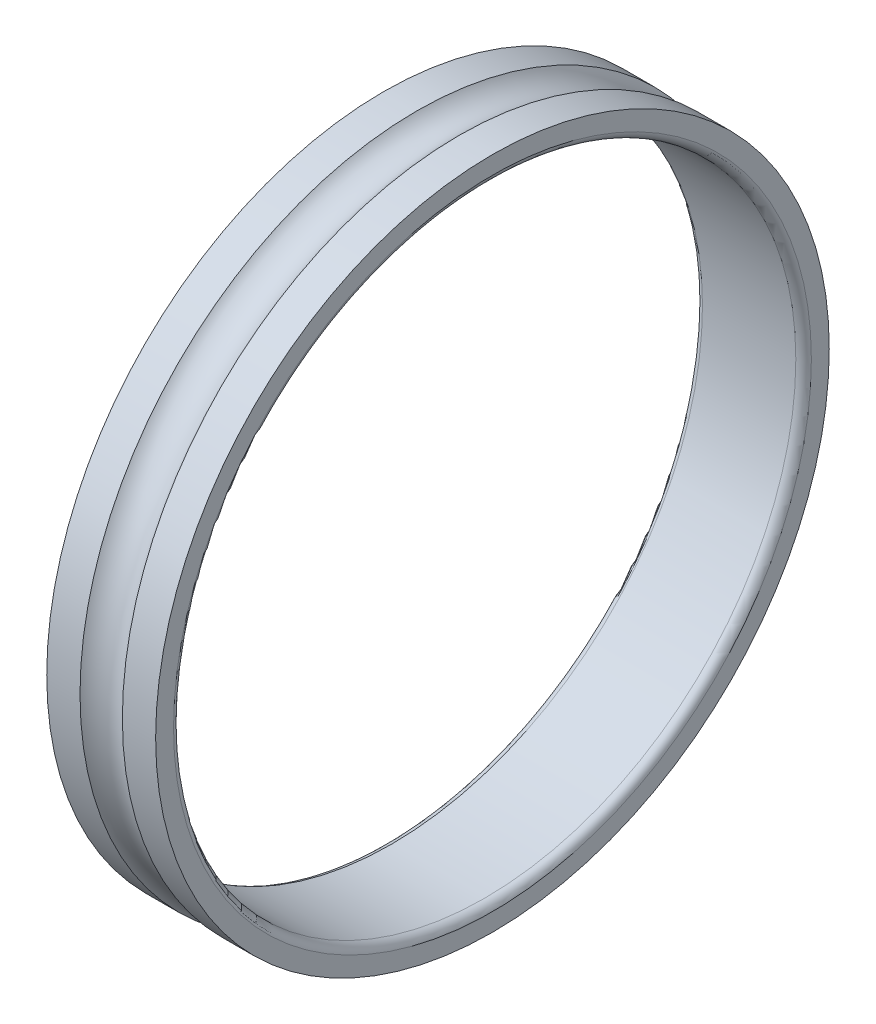
ISO-10303-21;
HEADER;
FILE_DESCRIPTION(('STEP AP214'),'2;1');
FILE_NAME('part.step','',(''),(''),'','','');
FILE_SCHEMA(('AUTOMOTIVE_DESIGN { 1 0 10303 214 1 1 1 1 }'));
ENDSEC;
DATA;
#1=APPLICATION_CONTEXT('core data for automotive mechanical design processes');
#2=APPLICATION_PROTOCOL_DEFINITION('international standard','automotive_design',2000,#1);
#3=PRODUCT_CONTEXT('',#1,'mechanical');
#4=PRODUCT('Part','Part','',(#3));
#5=PRODUCT_RELATED_PRODUCT_CATEGORY('part','',(#4));
#6=PRODUCT_DEFINITION_FORMATION('','',#4);
#7=PRODUCT_DEFINITION_CONTEXT('part definition',#1,'design');
#8=PRODUCT_DEFINITION('design','',#6,#7);
#9=PRODUCT_DEFINITION_SHAPE('','',#8);
#10=(LENGTH_UNIT() NAMED_UNIT(*) SI_UNIT(.MILLI.,.METRE.));
#11=(NAMED_UNIT(*) PLANE_ANGLE_UNIT() SI_UNIT($,.RADIAN.));
#12=(NAMED_UNIT(*) SI_UNIT($,.STERADIAN.) SOLID_ANGLE_UNIT());
#13=UNCERTAINTY_MEASURE_WITH_UNIT(LENGTH_MEASURE(1.E-05),#10,'distance_accuracy_value','');
#14=(GEOMETRIC_REPRESENTATION_CONTEXT(3) GLOBAL_UNCERTAINTY_ASSIGNED_CONTEXT((#13)) GLOBAL_UNIT_ASSIGNED_CONTEXT((#10,
#11,#12)) REPRESENTATION_CONTEXT('',''));
#15=CARTESIAN_POINT('',(0.,0.,0.));
#16=DIRECTION('',(0.,0.,1.));
#17=DIRECTION('',(1.,0.,0.));
#18=AXIS2_PLACEMENT_3D('',#15,#16,#17);
#19=CARTESIAN_POINT('',(7.,0.,0.));
#20=DIRECTION('',(1.,0.,0.));
#21=DIRECTION('',(0.,0.,-1.));
#22=AXIS2_PLACEMENT_3D('',#19,#20,#21);
#23=CYLINDRICAL_SURFACE('',#22,21.65);
#24=CARTESIAN_POINT('',(2.13893424111838,0.,0.));
#25=DIRECTION('',(1.,0.,0.));
#26=DIRECTION('',(0.,0.,-1.));
#27=AXIS2_PLACEMENT_3D('',#24,#25,#26);
#28=CIRCLE('',#27,21.65);
#29=CARTESIAN_POINT('',(2.13893424111838,0.,-21.65));
#30=VERTEX_POINT('',#29);
#31=EDGE_CURVE('E10',#30,#30,#28,.T.);
#32=ORIENTED_EDGE('',*,*,#31,.F.);
#33=EDGE_LOOP('',(#32));
#34=FACE_BOUND('',#33,.T.);
#35=CARTESIAN_POINT('',(0.,0.,0.));
#36=DIRECTION('',(1.,0.,0.));
#37=DIRECTION('',(0.,0.,-1.));
#38=AXIS2_PLACEMENT_3D('',#35,#36,#37);
#39=CIRCLE('',#38,21.65);
#40=CARTESIAN_POINT('',(0.,0.,-21.65));
#41=VERTEX_POINT('',#40);
#42=EDGE_CURVE('E37',#41,#41,#39,.T.);
#43=ORIENTED_EDGE('',*,*,#42,.T.);
#44=EDGE_LOOP('',(#43));
#45=FACE_BOUND('',#44,.T.);
#46=ADVANCED_FACE('F14',(#34,#45),#23,.T.);
#47=CARTESIAN_POINT('',(3.5,0.,0.));
#48=DIRECTION('',(1.,0.,0.));
#49=DIRECTION('',(0.,0.,-1.));
#50=AXIS2_PLACEMENT_3D('',#47,#48,#49);
#51=TOROIDAL_SURFACE('',#50,22.75,1.75);
#52=ORIENTED_EDGE('',*,*,#31,.T.);
#53=EDGE_LOOP('',(#52));
#54=FACE_BOUND('',#53,.T.);
#55=CARTESIAN_POINT('',(4.86106575888162,0.,0.));
#56=DIRECTION('',(1.,0.,0.));
#57=DIRECTION('',(0.,0.,-1.));
#58=AXIS2_PLACEMENT_3D('',#55,#56,#57);
#59=CIRCLE('',#58,21.65);
#60=CARTESIAN_POINT('',(4.86106575888162,0.,-21.65));
#61=VERTEX_POINT('',#60);
#62=EDGE_CURVE('E18',#61,#61,#59,.T.);
#63=ORIENTED_EDGE('',*,*,#62,.F.);
#64=EDGE_LOOP('',(#63));
#65=FACE_BOUND('',#64,.T.);
#66=ADVANCED_FACE('F16',(#54,#65),#51,.F.);
#67=CARTESIAN_POINT('',(7.,0.,0.));
#68=DIRECTION('',(1.,0.,0.));
#69=DIRECTION('',(0.,0.,-1.));
#70=AXIS2_PLACEMENT_3D('',#67,#68,#69);
#71=CYLINDRICAL_SURFACE('',#70,21.65);
#72=CARTESIAN_POINT('',(7.,0.,0.));
#73=DIRECTION('',(1.,0.,0.));
#74=DIRECTION('',(0.,0.,-1.));
#75=AXIS2_PLACEMENT_3D('',#72,#73,#74);
#76=CIRCLE('',#75,21.65);
#77=CARTESIAN_POINT('',(7.,0.,-21.65));
#78=VERTEX_POINT('',#77);
#79=EDGE_CURVE('E33',#78,#78,#76,.T.);
#80=ORIENTED_EDGE('',*,*,#79,.F.);
#81=EDGE_LOOP('',(#80));
#82=FACE_BOUND('',#81,.T.);
#83=ORIENTED_EDGE('',*,*,#62,.T.);
#84=EDGE_LOOP('',(#83));
#85=FACE_BOUND('',#84,.T.);
#86=ADVANCED_FACE('F69',(#82,#85),#71,.T.);
#87=CARTESIAN_POINT('',(7.,20.5,0.));
#88=DIRECTION('',(1.,0.,0.));
#89=DIRECTION('',(0.,1.,0.));
#90=AXIS2_PLACEMENT_3D('',#87,#88,#89);
#91=PLANE('',#90);
#92=CARTESIAN_POINT('',(7.,0.,0.));
#93=DIRECTION('',(1.,0.,0.));
#94=DIRECTION('',(0.,0.,-1.));
#95=AXIS2_PLACEMENT_3D('',#92,#93,#94);
#96=CIRCLE('',#95,20.5);
#97=CARTESIAN_POINT('',(7.,0.,-20.5));
#98=VERTEX_POINT('',#97);
#99=EDGE_CURVE('E34',#98,#98,#96,.T.);
#100=ORIENTED_EDGE('',*,*,#99,.F.);
#101=EDGE_LOOP('',(#100));
#102=FACE_BOUND('',#101,.T.);
#103=ORIENTED_EDGE('',*,*,#79,.T.);
#104=EDGE_LOOP('',(#103));
#105=FACE_BOUND('',#104,.T.);
#106=ADVANCED_FACE('F61',(#102,#105),#91,.T.);
#107=CARTESIAN_POINT('',(6.40721726997995,0.,0.));
#108=DIRECTION('',(1.,0.,0.));
#109=DIRECTION('',(0.,0.,-1.));
#110=AXIS2_PLACEMENT_3D('',#107,#108,#109);
#111=TOROIDAL_SURFACE('',#110,20.59278273002,0.599999999999993);
#112=CARTESIAN_POINT('',(6.5,0.,0.));
#113=DIRECTION('',(1.,0.,0.));
#114=DIRECTION('',(0.,0.,-1.));
#115=AXIS2_PLACEMENT_3D('',#112,#113,#114);
#116=CIRCLE('',#115,20.);
#117=CARTESIAN_POINT('',(6.5,0.,-20.));
#118=VERTEX_POINT('',#117);
#119=EDGE_CURVE('E48',#118,#118,#116,.T.);
#120=ORIENTED_EDGE('',*,*,#119,.F.);
#121=EDGE_LOOP('',(#120));
#122=FACE_BOUND('',#121,.T.);
#123=ORIENTED_EDGE('',*,*,#99,.T.);
#124=EDGE_LOOP('',(#123));
#125=FACE_BOUND('',#124,.T.);
#126=ADVANCED_FACE('F59',(#122,#125),#111,.T.);
#127=CARTESIAN_POINT('',(7.,0.,0.));
#128=DIRECTION('',(1.,0.,0.));
#129=DIRECTION('',(0.,0.,-1.));
#130=AXIS2_PLACEMENT_3D('',#127,#128,#129);
#131=CYLINDRICAL_SURFACE('',#130,20.);
#132=CARTESIAN_POINT('',(0.499999999999993,0.,0.));
#133=DIRECTION('',(1.,0.,0.));
#134=DIRECTION('',(0.,0.,-1.));
#135=AXIS2_PLACEMENT_3D('',#132,#133,#134);
#136=CIRCLE('',#135,20.);
#137=CARTESIAN_POINT('',(0.499999999999993,0.,-20.));
#138=VERTEX_POINT('',#137);
#139=EDGE_CURVE('E42',#138,#138,#136,.T.);
#140=ORIENTED_EDGE('',*,*,#139,.F.);
#141=EDGE_LOOP('',(#140));
#142=FACE_BOUND('',#141,.T.);
#143=ORIENTED_EDGE('',*,*,#119,.T.);
#144=EDGE_LOOP('',(#143));
#145=FACE_BOUND('',#144,.T.);
#146=ADVANCED_FACE('F57',(#142,#145),#131,.F.);
#147=CARTESIAN_POINT('',(0.592782730020048,0.,0.));
#148=DIRECTION('',(1.,0.,0.));
#149=DIRECTION('',(0.,0.,-1.));
#150=AXIS2_PLACEMENT_3D('',#147,#148,#149);
#151=TOROIDAL_SURFACE('',#150,20.59278273002,0.6);
#152=CARTESIAN_POINT('',(0.,0.,0.));
#153=DIRECTION('',(1.,0.,0.));
#154=DIRECTION('',(0.,0.,-1.));
#155=AXIS2_PLACEMENT_3D('',#152,#153,#154);
#156=CIRCLE('',#155,20.5);
#157=CARTESIAN_POINT('',(0.,0.,-20.5));
#158=VERTEX_POINT('',#157);
#159=EDGE_CURVE('E38',#158,#158,#156,.T.);
#160=ORIENTED_EDGE('',*,*,#159,.F.);
#161=EDGE_LOOP('',(#160));
#162=FACE_BOUND('',#161,.T.);
#163=ORIENTED_EDGE('',*,*,#139,.T.);
#164=EDGE_LOOP('',(#163));
#165=FACE_BOUND('',#164,.T.);
#166=ADVANCED_FACE('F90',(#162,#165),#151,.T.);
#167=CARTESIAN_POINT('',(0.,21.65,0.));
#168=DIRECTION('',(-1.,0.,0.));
#169=DIRECTION('',(0.,0.,1.));
#170=AXIS2_PLACEMENT_3D('',#167,#168,#169);
#171=PLANE('',#170);
#172=ORIENTED_EDGE('',*,*,#42,.F.);
#173=EDGE_LOOP('',(#172));
#174=FACE_BOUND('',#173,.T.);
#175=ORIENTED_EDGE('',*,*,#159,.T.);
#176=EDGE_LOOP('',(#175));
#177=FACE_BOUND('',#176,.T.);
#178=ADVANCED_FACE('F88',(#174,#177),#171,.T.);
#179=CLOSED_SHELL('',(#46,#66,#86,#106,#126,#146,#166,#178));
#180=MANIFOLD_SOLID_BREP('B1',#179);
#181=ADVANCED_BREP_SHAPE_REPRESENTATION('',(#18,#180),#14);
#182=SHAPE_DEFINITION_REPRESENTATION(#9,#181);
ENDSEC;
END-ISO-10303-21;
